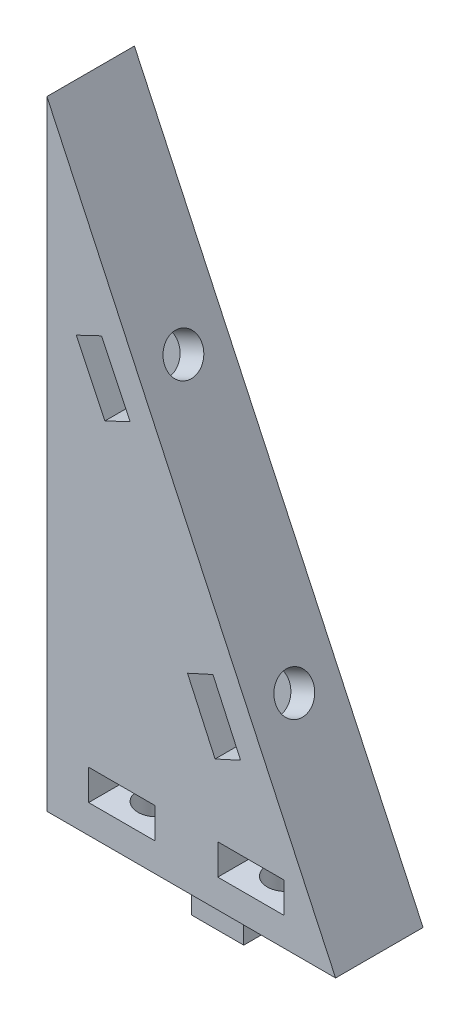
ISO-10303-21;
HEADER;
FILE_DESCRIPTION(('STEP AP214'),'2;1');
FILE_NAME('part.step','',(''),(''),'','','');
FILE_SCHEMA(('AUTOMOTIVE_DESIGN { 1 0 10303 214 1 1 1 1 }'));
ENDSEC;
DATA;
#1=APPLICATION_CONTEXT('core data for automotive mechanical design processes');
#2=APPLICATION_PROTOCOL_DEFINITION('international standard','automotive_design',2000,#1);
#3=PRODUCT_CONTEXT('',#1,'mechanical');
#4=PRODUCT('Part','Part','',(#3));
#5=PRODUCT_RELATED_PRODUCT_CATEGORY('part','',(#4));
#6=PRODUCT_DEFINITION_FORMATION('','',#4);
#7=PRODUCT_DEFINITION_CONTEXT('part definition',#1,'design');
#8=PRODUCT_DEFINITION('design','',#6,#7);
#9=PRODUCT_DEFINITION_SHAPE('','',#8);
#10=(LENGTH_UNIT() NAMED_UNIT(*) SI_UNIT(.MILLI.,.METRE.));
#11=(NAMED_UNIT(*) PLANE_ANGLE_UNIT() SI_UNIT($,.RADIAN.));
#12=(NAMED_UNIT(*) SI_UNIT($,.STERADIAN.) SOLID_ANGLE_UNIT());
#13=UNCERTAINTY_MEASURE_WITH_UNIT(LENGTH_MEASURE(1.E-05),#10,'distance_accuracy_value','');
#14=(GEOMETRIC_REPRESENTATION_CONTEXT(3) GLOBAL_UNCERTAINTY_ASSIGNED_CONTEXT((#13)) GLOBAL_UNIT_ASSIGNED_CONTEXT((#10,
#11,#12)) REPRESENTATION_CONTEXT('',''));
#15=CARTESIAN_POINT('',(0.,0.,0.));
#16=DIRECTION('',(0.,0.,1.));
#17=DIRECTION('',(1.,0.,0.));
#18=AXIS2_PLACEMENT_3D('',#15,#16,#17);
#19=CARTESIAN_POINT('',(16.6637331345963,17.7599657911358,5.));
#20=DIRECTION('',(0.906307787036648,0.422618261740704,0.));
#21=DIRECTION('',(-0.422618261740704,0.906307787036648,0.));
#22=AXIS2_PLACEMENT_3D('',#19,#20,#21);
#23=CYLINDRICAL_SURFACE('',#22,2.15);
#24=CARTESIAN_POINT('',(20.5601904393254,19.5769136720049,5.));
#25=DIRECTION('',(0.909777493819102,0.415096268039396,0.));
#26=DIRECTION('',(-0.415096268039396,0.909777493819102,0.));
#27=AXIS2_PLACEMENT_3D('',#24,#25,#26);
#28=ELLIPSE('',#27,2.15007376822944,2.15);
#29=CARTESIAN_POINT('',(19.6677028421239,21.5330023963909,5.));
#30=VERTEX_POINT('',#29);
#31=EDGE_CURVE('E500',#30,#30,#28,.F.);
#32=ORIENTED_EDGE('',*,*,#31,.T.);
#33=EDGE_LOOP('',(#32));
#34=FACE_BOUND('',#33,.T.);
#35=CARTESIAN_POINT('',(23.2797799799638,20.8450791018429,5.));
#36=DIRECTION('',(0.906307787036648,0.422618261740704,0.));
#37=DIRECTION('',(-0.422618261740704,0.906307787036648,0.));
#38=AXIS2_PLACEMENT_3D('',#35,#36,#37);
#39=CIRCLE('',#38,2.15);
#40=CARTESIAN_POINT('',(22.3711507172213,22.7936408439717,5.));
#41=VERTEX_POINT('',#40);
#42=EDGE_CURVE('E385',#41,#41,#39,.T.);
#43=ORIENTED_EDGE('',*,*,#42,.T.);
#44=EDGE_LOOP('',(#43));
#45=FACE_BOUND('',#44,.T.);
#46=ADVANCED_FACE('F38',(#34,#45),#23,.F.);
#47=CARTESIAN_POINT('',(0.,0.,10.));
#48=DIRECTION('',(0.,0.,-1.));
#49=DIRECTION('',(-1.,0.,0.));
#50=AXIS2_PLACEMENT_3D('',#47,#48,#49);
#51=PLANE('',#50);
#52=DIRECTION('',(-0.430111255691984,0.902775890089597,0.));
#53=VECTOR('',#52,1.);
#54=CARTESIAN_POINT('',(7.88044131743355,46.7688135237958,10.));
#55=LINE('',#54,#53);
#56=CARTESIAN_POINT('',(9.51486408906308,43.3382651414554,10.));
#57=VERTEX_POINT('',#56);
#58=CARTESIAN_POINT('',(6.24601854580401,50.1993619061363,10.));
#59=VERTEX_POINT('',#58);
#60=EDGE_CURVE('E213',#57,#59,#55,.T.);
#61=ORIENTED_EDGE('',*,*,#60,.F.);
#62=DIRECTION('',(0.902775890089597,0.430111255691984,0.));
#63=VECTOR('',#62,1.);
#64=CARTESIAN_POINT('',(6.62598124077637,41.961909123241,10.));
#65=LINE('',#64,#63);
#66=CARTESIAN_POINT('',(6.62598124077637,41.961909123241,10.));
#67=VERTEX_POINT('',#66);
#68=EDGE_CURVE('E56',#67,#57,#65,.T.);
#69=ORIENTED_EDGE('',*,*,#68,.F.);
#70=DIRECTION('',(0.430111255691984,-0.902775890089597,0.));
#71=VECTOR('',#70,1.);
#72=CARTESIAN_POINT('',(3.3571356975173,48.8230058879219,10.));
#73=LINE('',#72,#71);
#74=CARTESIAN_POINT('',(3.3571356975173,48.8230058879219,10.));
#75=VERTEX_POINT('',#74);
#76=EDGE_CURVE('E236',#75,#67,#73,.T.);
#77=ORIENTED_EDGE('',*,*,#76,.F.);
#78=DIRECTION('',(-0.902775890089597,-0.430111255691984,0.));
#79=VECTOR('',#78,1.);
#80=CARTESIAN_POINT('',(6.24601854580401,50.1993619061363,10.));
#81=LINE('',#80,#79);
#82=EDGE_CURVE('E232',#59,#75,#81,.T.);
#83=ORIENTED_EDGE('',*,*,#82,.F.);
#84=EDGE_LOOP('',(#61,#69,#77,#83));
#85=FACE_BOUND('',#84,.T.);
#86=DIRECTION('',(0.415096268039402,-0.909777493819099,0.));
#87=VECTOR('',#86,1.);
#88=CARTESIAN_POINT('',(19.2243599685231,14.7956336294728,10.));
#89=LINE('',#88,#87);
#90=CARTESIAN_POINT('',(16.0696283314237,21.709942582498,10.));
#91=VERTEX_POINT('',#90);
#92=CARTESIAN_POINT('',(19.2243599685231,14.7956336294728,10.));
#93=VERTEX_POINT('',#92);
#94=EDGE_CURVE('E270',#91,#93,#89,.T.);
#95=ORIENTED_EDGE('',*,*,#94,.F.);
#96=DIRECTION('',(-0.909777493819099,-0.415096268039402,0.));
#97=VECTOR('',#96,1.);
#98=CARTESIAN_POINT('',(16.0696283314237,21.709942582498,10.));
#99=LINE('',#98,#97);
#100=CARTESIAN_POINT('',(18.9809163116448,23.0382506402241,10.));
#101=VERTEX_POINT('',#100);
#102=EDGE_CURVE('E64',#101,#91,#99,.T.);
#103=ORIENTED_EDGE('',*,*,#102,.F.);
#104=DIRECTION('',(-0.415096268039396,0.909777493819102,0.));
#105=VECTOR('',#104,1.);
#106=CARTESIAN_POINT('',(18.9809163116448,23.0382506402241,10.));
#107=LINE('',#106,#105);
#108=CARTESIAN_POINT('',(22.1356479487443,16.1239416871989,10.));
#109=VERTEX_POINT('',#108);
#110=EDGE_CURVE('E256',#109,#101,#107,.T.);
#111=ORIENTED_EDGE('',*,*,#110,.F.);
#112=DIRECTION('',(0.9097774938191,0.415096268039401,0.));
#113=VECTOR('',#112,1.);
#114=CARTESIAN_POINT('',(22.1356479487443,16.1239416871989,10.));
#115=LINE('',#114,#113);
#116=EDGE_CURVE('E274',#93,#109,#115,.T.);
#117=ORIENTED_EDGE('',*,*,#116,.F.);
#118=EDGE_LOOP('',(#95,#103,#111,#117));
#119=FACE_BOUND('',#118,.T.);
#120=DIRECTION('',(1.,0.,0.));
#121=VECTOR('',#120,1.);
#122=CARTESIAN_POINT('',(0.,6.75172864189275,10.));
#123=LINE('',#122,#121);
#124=CARTESIAN_POINT('',(19.53,6.75172864189274,10.));
#125=VERTEX_POINT('',#124);
#126=CARTESIAN_POINT('',(27.13,6.75172864189274,10.));
#127=VERTEX_POINT('',#126);
#128=EDGE_CURVE('E350',#125,#127,#123,.T.);
#129=ORIENTED_EDGE('',*,*,#128,.T.);
#130=DIRECTION('',(0.,-1.,0.));
#131=VECTOR('',#130,1.);
#132=CARTESIAN_POINT('',(27.13,0.,10.));
#133=LINE('',#132,#131);
#134=CARTESIAN_POINT('',(27.13,3.25172864189274,10.));
#135=VERTEX_POINT('',#134);
#136=EDGE_CURVE('E354',#127,#135,#133,.T.);
#137=ORIENTED_EDGE('',*,*,#136,.T.);
#138=DIRECTION('',(-1.,0.,0.));
#139=VECTOR('',#138,1.);
#140=CARTESIAN_POINT('',(0.,3.25172864189274,10.));
#141=LINE('',#140,#139);
#142=CARTESIAN_POINT('',(19.53,3.25172864189274,10.));
#143=VERTEX_POINT('',#142);
#144=EDGE_CURVE('E359',#135,#143,#141,.T.);
#145=ORIENTED_EDGE('',*,*,#144,.T.);
#146=DIRECTION('',(0.,1.,0.));
#147=VECTOR('',#146,1.);
#148=CARTESIAN_POINT('',(19.53,0.,10.));
#149=LINE('',#148,#147);
#150=EDGE_CURVE('E340',#143,#125,#149,.T.);
#151=ORIENTED_EDGE('',*,*,#150,.T.);
#152=EDGE_LOOP('',(#129,#137,#145,#151));
#153=FACE_BOUND('',#152,.T.);
#154=DIRECTION('',(-0.422618261740704,0.906307787036648,0.));
#155=VECTOR('',#154,1.);
#156=CARTESIAN_POINT('',(33.,0.,10.));
#157=LINE('',#156,#155);
#158=CARTESIAN_POINT('',(33.,0.,10.));
#159=VERTEX_POINT('',#158);
#160=CARTESIAN_POINT('',(0.,70.7687283768145,10.));
#161=VERTEX_POINT('',#160);
#162=EDGE_CURVE('E459',#159,#161,#157,.T.);
#163=ORIENTED_EDGE('',*,*,#162,.T.);
#164=DIRECTION('',(0.,-1.,0.));
#165=VECTOR('',#164,1.);
#166=CARTESIAN_POINT('',(0.,70.7687283768145,10.));
#167=LINE('',#166,#165);
#168=CARTESIAN_POINT('',(0.,0.,10.));
#169=VERTEX_POINT('',#168);
#170=EDGE_CURVE('E463',#161,#169,#167,.T.);
#171=ORIENTED_EDGE('',*,*,#170,.T.);
#172=DIRECTION('',(1.,0.,0.));
#173=VECTOR('',#172,1.);
#174=CARTESIAN_POINT('',(0.,0.,10.));
#175=LINE('',#174,#173);
#176=EDGE_CURVE('E467',#169,#159,#175,.T.);
#177=ORIENTED_EDGE('',*,*,#176,.T.);
#178=EDGE_LOOP('',(#163,#171,#177));
#179=FACE_BOUND('',#178,.T.);
#180=DIRECTION('',(0.,-1.,0.));
#181=VECTOR('',#180,1.);
#182=CARTESIAN_POINT('',(12.3679115650385,0.,10.));
#183=LINE('',#182,#181);
#184=CARTESIAN_POINT('',(12.3679115650385,6.75172864189274,10.));
#185=VERTEX_POINT('',#184);
#186=CARTESIAN_POINT('',(12.3679115650385,3.25172864189274,10.));
#187=VERTEX_POINT('',#186);
#188=EDGE_CURVE('E306',#185,#187,#183,.T.);
#189=ORIENTED_EDGE('',*,*,#188,.T.);
#190=DIRECTION('',(-1.,0.,0.));
#191=VECTOR('',#190,1.);
#192=CARTESIAN_POINT('',(0.,3.25172864189274,10.));
#193=LINE('',#192,#191);
#194=CARTESIAN_POINT('',(4.76791156503854,3.25172864189274,10.));
#195=VERTEX_POINT('',#194);
#196=EDGE_CURVE('E296',#187,#195,#193,.T.);
#197=ORIENTED_EDGE('',*,*,#196,.T.);
#198=DIRECTION('',(0.,1.,0.));
#199=VECTOR('',#198,1.);
#200=CARTESIAN_POINT('',(4.76791156503854,0.,10.));
#201=LINE('',#200,#199);
#202=CARTESIAN_POINT('',(4.76791156503854,6.75172864189274,10.));
#203=VERTEX_POINT('',#202);
#204=EDGE_CURVE('E314',#195,#203,#201,.T.);
#205=ORIENTED_EDGE('',*,*,#204,.T.);
#206=DIRECTION('',(1.,0.,0.));
#207=VECTOR('',#206,1.);
#208=CARTESIAN_POINT('',(0.,6.75172864189274,10.));
#209=LINE('',#208,#207);
#210=EDGE_CURVE('E310',#203,#185,#209,.T.);
#211=ORIENTED_EDGE('',*,*,#210,.T.);
#212=EDGE_LOOP('',(#189,#197,#205,#211));
#213=FACE_BOUND('',#212,.T.);
#214=ADVANCED_FACE('F532',(#85,#119,#153,#179,#213),#51,.F.);
#215=CARTESIAN_POINT('',(8.55,12.,6.));
#216=DIRECTION('',(0.,-1.,0.));
#217=DIRECTION('',(1.,0.,0.));
#218=AXIS2_PLACEMENT_3D('',#215,#216,#217);
#219=CYLINDRICAL_SURFACE('',#218,2.15);
#220=CARTESIAN_POINT('',(8.55,0.,6.));
#221=DIRECTION('',(0.,-1.,0.));
#222=DIRECTION('',(1.,0.,0.));
#223=AXIS2_PLACEMENT_3D('',#220,#221,#222);
#224=CIRCLE('',#223,2.15);
#225=CARTESIAN_POINT('',(10.7,0.,6.));
#226=VERTEX_POINT('',#225);
#227=EDGE_CURVE('E384',#226,#226,#224,.T.);
#228=ORIENTED_EDGE('',*,*,#227,.T.);
#229=EDGE_LOOP('',(#228));
#230=FACE_BOUND('',#229,.T.);
#231=CARTESIAN_POINT('',(8.55,3.25172864189274,6.));
#232=DIRECTION('',(0.,1.,0.));
#233=DIRECTION('',(0.,0.,1.));
#234=AXIS2_PLACEMENT_3D('',#231,#232,#233);
#235=CIRCLE('',#234,2.15);
#236=CARTESIAN_POINT('',(8.55,3.25172864189274,8.15));
#237=VERTEX_POINT('',#236);
#238=EDGE_CURVE('E355',#237,#237,#235,.F.);
#239=ORIENTED_EDGE('',*,*,#238,.F.);
#240=EDGE_LOOP('',(#239));
#241=FACE_BOUND('',#240,.T.);
#242=ADVANCED_FACE('F539',(#230,#241),#219,.F.);
#243=CARTESIAN_POINT('',(23.33,12.,6.));
#244=DIRECTION('',(0.,-1.,0.));
#245=DIRECTION('',(1.,0.,0.));
#246=AXIS2_PLACEMENT_3D('',#243,#244,#245);
#247=CYLINDRICAL_SURFACE('',#246,2.15);
#248=CARTESIAN_POINT('',(23.33,0.,6.));
#249=DIRECTION('',(0.,-1.,0.));
#250=DIRECTION('',(1.,0.,0.));
#251=AXIS2_PLACEMENT_3D('',#248,#249,#250);
#252=CIRCLE('',#251,2.15);
#253=CARTESIAN_POINT('',(25.48,0.,6.));
#254=VERTEX_POINT('',#253);
#255=EDGE_CURVE('E403',#254,#254,#252,.T.);
#256=ORIENTED_EDGE('',*,*,#255,.T.);
#257=EDGE_LOOP('',(#256));
#258=FACE_BOUND('',#257,.T.);
#259=CARTESIAN_POINT('',(23.33,3.25172864189274,6.));
#260=DIRECTION('',(0.,1.,0.));
#261=DIRECTION('',(0.,0.,1.));
#262=AXIS2_PLACEMENT_3D('',#259,#260,#261);
#263=CIRCLE('',#262,2.15);
#264=CARTESIAN_POINT('',(23.33,3.25172864189274,8.15));
#265=VERTEX_POINT('',#264);
#266=EDGE_CURVE('E379',#265,#265,#263,.F.);
#267=ORIENTED_EDGE('',*,*,#266,.F.);
#268=EDGE_LOOP('',(#267));
#269=FACE_BOUND('',#268,.T.);
#270=ADVANCED_FACE('F627',(#258,#269),#247,.F.);
#271=CARTESIAN_POINT('',(0.,0.,10.));
#272=DIRECTION('',(0.,1.,0.));
#273=DIRECTION('',(0.,0.,1.));
#274=AXIS2_PLACEMENT_3D('',#271,#272,#273);
#275=PLANE('',#274);
#276=ORIENTED_EDGE('',*,*,#255,.F.);
#277=EDGE_LOOP('',(#276));
#278=FACE_BOUND('',#277,.T.);
#279=ORIENTED_EDGE('',*,*,#227,.F.);
#280=EDGE_LOOP('',(#279));
#281=FACE_BOUND('',#280,.T.);
#282=DIRECTION('',(1.,0.,0.));
#283=VECTOR('',#282,1.);
#284=CARTESIAN_POINT('',(0.,0.,0.));
#285=LINE('',#284,#283);
#286=CARTESIAN_POINT('',(0.,0.,0.));
#287=VERTEX_POINT('',#286);
#288=CARTESIAN_POINT('',(33.,0.,0.));
#289=VERTEX_POINT('',#288);
#290=EDGE_CURVE('E464',#287,#289,#285,.T.);
#291=ORIENTED_EDGE('',*,*,#290,.T.);
#292=DIRECTION('',(0.,0.,-1.));
#293=VECTOR('',#292,1.);
#294=CARTESIAN_POINT('',(33.,0.,10.));
#295=LINE('',#294,#293);
#296=EDGE_CURVE('E470',#159,#289,#295,.T.);
#297=ORIENTED_EDGE('',*,*,#296,.F.);
#298=ORIENTED_EDGE('',*,*,#176,.F.);
#299=DIRECTION('',(0.,0.,-1.));
#300=VECTOR('',#299,1.);
#301=CARTESIAN_POINT('',(0.,0.,10.));
#302=LINE('',#301,#300);
#303=EDGE_CURVE('E48',#169,#287,#302,.T.);
#304=ORIENTED_EDGE('',*,*,#303,.T.);
#305=EDGE_LOOP('',(#291,#297,#298,#304));
#306=FACE_BOUND('',#305,.T.);
#307=DIRECTION('',(0.,0.,1.));
#308=VECTOR('',#307,1.);
#309=CARTESIAN_POINT('',(19.5,0.,7.));
#310=LINE('',#309,#308);
#311=CARTESIAN_POINT('',(19.5,0.,3.));
#312=VERTEX_POINT('',#311);
#313=CARTESIAN_POINT('',(19.5,0.,7.));
#314=VERTEX_POINT('',#313);
#315=EDGE_CURVE('E402',#312,#314,#310,.T.);
#316=ORIENTED_EDGE('',*,*,#315,.F.);
#317=DIRECTION('',(1.,0.,0.));
#318=VECTOR('',#317,1.);
#319=CARTESIAN_POINT('',(13.5,0.,3.));
#320=LINE('',#319,#318);
#321=CARTESIAN_POINT('',(13.5,0.,3.));
#322=VERTEX_POINT('',#321);
#323=EDGE_CURVE('E419',#322,#312,#320,.T.);
#324=ORIENTED_EDGE('',*,*,#323,.F.);
#325=DIRECTION('',(0.,0.,-1.));
#326=VECTOR('',#325,1.);
#327=CARTESIAN_POINT('',(13.5,0.,7.));
#328=LINE('',#327,#326);
#329=CARTESIAN_POINT('',(13.5,0.,7.));
#330=VERTEX_POINT('',#329);
#331=EDGE_CURVE('E436',#330,#322,#328,.T.);
#332=ORIENTED_EDGE('',*,*,#331,.F.);
#333=DIRECTION('',(-1.,0.,0.));
#334=VECTOR('',#333,1.);
#335=CARTESIAN_POINT('',(13.5,0.,7.));
#336=LINE('',#335,#334);
#337=EDGE_CURVE('E432',#314,#330,#336,.T.);
#338=ORIENTED_EDGE('',*,*,#337,.F.);
#339=EDGE_LOOP('',(#316,#324,#332,#338));
#340=FACE_BOUND('',#339,.T.);
#341=ADVANCED_FACE('F636',(#278,#281,#306,#340),#275,.F.);
#342=CARTESIAN_POINT('',(33.,0.,10.));
#343=DIRECTION('',(-0.906307787036648,-0.422618261740704,0.));
#344=DIRECTION('',(0.422618261740704,-0.906307787036648,0.));
#345=AXIS2_PLACEMENT_3D('',#342,#343,#344);
#346=PLANE('',#345);
#347=ORIENTED_EDGE('',*,*,#42,.F.);
#348=EDGE_LOOP('',(#347));
#349=FACE_BOUND('',#348,.T.);
#350=CARTESIAN_POINT('',(10.6012321277427,48.0343127129423,5.));
#351=DIRECTION('',(0.906307787036648,0.422618261740704,0.));
#352=DIRECTION('',(-0.422618261740704,0.906307787036648,0.));
#353=AXIS2_PLACEMENT_3D('',#350,#351,#352);
#354=CIRCLE('',#353,2.15);
#355=CARTESIAN_POINT('',(9.69260286500018,49.9828744550711,5.));
#356=VERTEX_POINT('',#355);
#357=EDGE_CURVE('E393',#356,#356,#354,.T.);
#358=ORIENTED_EDGE('',*,*,#357,.F.);
#359=EDGE_LOOP('',(#358));
#360=FACE_BOUND('',#359,.T.);
#361=DIRECTION('',(-0.422618261740704,0.906307787036648,0.));
#362=VECTOR('',#361,1.);
#363=CARTESIAN_POINT('',(33.,0.,0.));
#364=LINE('',#363,#362);
#365=CARTESIAN_POINT('',(0.,70.7687283768145,0.));
#366=VERTEX_POINT('',#365);
#367=EDGE_CURVE('E458',#289,#366,#364,.T.);
#368=ORIENTED_EDGE('',*,*,#367,.T.);
#369=DIRECTION('',(0.,0.,-1.));
#370=VECTOR('',#369,1.);
#371=CARTESIAN_POINT('',(0.,70.7687283768145,10.));
#372=LINE('',#371,#370);
#373=EDGE_CURVE('E11',#161,#366,#372,.T.);
#374=ORIENTED_EDGE('',*,*,#373,.F.);
#375=ORIENTED_EDGE('',*,*,#162,.F.);
#376=ORIENTED_EDGE('',*,*,#296,.T.);
#377=EDGE_LOOP('',(#368,#374,#375,#376));
#378=FACE_BOUND('',#377,.T.);
#379=ADVANCED_FACE('F40',(#349,#360,#378),#346,.F.);
#380=CARTESIAN_POINT('',(0.,70.7687283768145,10.));
#381=DIRECTION('',(1.,0.,0.));
#382=DIRECTION('',(0.,1.,0.));
#383=AXIS2_PLACEMENT_3D('',#380,#381,#382);
#384=PLANE('',#383);
#385=DIRECTION('',(0.,-1.,0.));
#386=VECTOR('',#385,1.);
#387=CARTESIAN_POINT('',(0.,70.7687283768145,0.));
#388=LINE('',#387,#386);
#389=EDGE_CURVE('E474',#366,#287,#388,.T.);
#390=ORIENTED_EDGE('',*,*,#389,.T.);
#391=ORIENTED_EDGE('',*,*,#303,.F.);
#392=ORIENTED_EDGE('',*,*,#170,.F.);
#393=ORIENTED_EDGE('',*,*,#373,.T.);
#394=EDGE_LOOP('',(#390,#391,#392,#393));
#395=FACE_BOUND('',#394,.T.);
#396=ADVANCED_FACE('F684',(#395),#384,.F.);
#397=CARTESIAN_POINT('',(0.,0.,0.));
#398=DIRECTION('',(0.,0.,-1.));
#399=DIRECTION('',(-1.,0.,0.));
#400=AXIS2_PLACEMENT_3D('',#397,#398,#399);
#401=PLANE('',#400);
#402=ORIENTED_EDGE('',*,*,#367,.F.);
#403=ORIENTED_EDGE('',*,*,#290,.F.);
#404=ORIENTED_EDGE('',*,*,#389,.F.);
#405=EDGE_LOOP('',(#402,#403,#404));
#406=FACE_BOUND('',#405,.T.);
#407=ADVANCED_FACE('F679',(#406),#401,.T.);
#408=CARTESIAN_POINT('',(19.5,-5.,7.));
#409=DIRECTION('',(-1.,0.,0.));
#410=DIRECTION('',(0.,-1.,0.));
#411=AXIS2_PLACEMENT_3D('',#408,#409,#410);
#412=PLANE('',#411);
#413=ORIENTED_EDGE('',*,*,#315,.T.);
#414=DIRECTION('',(0.,1.,0.));
#415=VECTOR('',#414,1.);
#416=CARTESIAN_POINT('',(19.5,-5.,7.));
#417=LINE('',#416,#415);
#418=CARTESIAN_POINT('',(19.5,-5.,7.));
#419=VERTEX_POINT('',#418);
#420=EDGE_CURVE('E454',#419,#314,#417,.T.);
#421=ORIENTED_EDGE('',*,*,#420,.F.);
#422=DIRECTION('',(0.,0.,1.));
#423=VECTOR('',#422,1.);
#424=CARTESIAN_POINT('',(19.5,-5.,7.));
#425=LINE('',#424,#423);
#426=CARTESIAN_POINT('',(19.5,-5.,3.));
#427=VERTEX_POINT('',#426);
#428=EDGE_CURVE('E414',#427,#419,#425,.T.);
#429=ORIENTED_EDGE('',*,*,#428,.F.);
#430=DIRECTION('',(0.,1.,0.));
#431=VECTOR('',#430,1.);
#432=CARTESIAN_POINT('',(19.5,-5.,3.));
#433=LINE('',#432,#431);
#434=EDGE_CURVE('E428',#427,#312,#433,.T.);
#435=ORIENTED_EDGE('',*,*,#434,.T.);
#436=EDGE_LOOP('',(#413,#421,#429,#435));
#437=FACE_BOUND('',#436,.T.);
#438=ADVANCED_FACE('F664',(#437),#412,.F.);
#439=CARTESIAN_POINT('',(13.5,-5.,7.));
#440=DIRECTION('',(0.,0.,-1.));
#441=DIRECTION('',(-1.,0.,0.));
#442=AXIS2_PLACEMENT_3D('',#439,#440,#441);
#443=PLANE('',#442);
#444=ORIENTED_EDGE('',*,*,#337,.T.);
#445=DIRECTION('',(0.,1.,0.));
#446=VECTOR('',#445,1.);
#447=CARTESIAN_POINT('',(13.5,-5.,7.));
#448=LINE('',#447,#446);
#449=CARTESIAN_POINT('',(13.5,-5.,7.));
#450=VERTEX_POINT('',#449);
#451=EDGE_CURVE('E450',#450,#330,#448,.T.);
#452=ORIENTED_EDGE('',*,*,#451,.F.);
#453=DIRECTION('',(-1.,0.,0.));
#454=VECTOR('',#453,1.);
#455=CARTESIAN_POINT('',(13.5,-5.,7.));
#456=LINE('',#455,#454);
#457=EDGE_CURVE('E418',#419,#450,#456,.T.);
#458=ORIENTED_EDGE('',*,*,#457,.F.);
#459=ORIENTED_EDGE('',*,*,#420,.T.);
#460=EDGE_LOOP('',(#444,#452,#458,#459));
#461=FACE_BOUND('',#460,.T.);
#462=ADVANCED_FACE('F671',(#461),#443,.F.);
#463=CARTESIAN_POINT('',(13.5,-5.,7.));
#464=DIRECTION('',(1.,0.,0.));
#465=DIRECTION('',(0.,1.,0.));
#466=AXIS2_PLACEMENT_3D('',#463,#464,#465);
#467=PLANE('',#466);
#468=ORIENTED_EDGE('',*,*,#331,.T.);
#469=DIRECTION('',(0.,1.,0.));
#470=VECTOR('',#469,1.);
#471=CARTESIAN_POINT('',(13.5,-5.,3.));
#472=LINE('',#471,#470);
#473=CARTESIAN_POINT('',(13.5,-5.,3.));
#474=VERTEX_POINT('',#473);
#475=EDGE_CURVE('E446',#474,#322,#472,.T.);
#476=ORIENTED_EDGE('',*,*,#475,.F.);
#477=DIRECTION('',(0.,0.,-1.));
#478=VECTOR('',#477,1.);
#479=CARTESIAN_POINT('',(13.5,-5.,7.));
#480=LINE('',#479,#478);
#481=EDGE_CURVE('E422',#450,#474,#480,.T.);
#482=ORIENTED_EDGE('',*,*,#481,.F.);
#483=ORIENTED_EDGE('',*,*,#451,.T.);
#484=EDGE_LOOP('',(#468,#476,#482,#483));
#485=FACE_BOUND('',#484,.T.);
#486=ADVANCED_FACE('F669',(#485),#467,.F.);
#487=CARTESIAN_POINT('',(13.5,-5.,3.));
#488=DIRECTION('',(0.,0.,1.));
#489=DIRECTION('',(1.,0.,0.));
#490=AXIS2_PLACEMENT_3D('',#487,#488,#489);
#491=PLANE('',#490);
#492=ORIENTED_EDGE('',*,*,#323,.T.);
#493=ORIENTED_EDGE('',*,*,#434,.F.);
#494=DIRECTION('',(1.,0.,0.));
#495=VECTOR('',#494,1.);
#496=CARTESIAN_POINT('',(13.5,-5.,3.));
#497=LINE('',#496,#495);
#498=EDGE_CURVE('E425',#474,#427,#497,.T.);
#499=ORIENTED_EDGE('',*,*,#498,.F.);
#500=ORIENTED_EDGE('',*,*,#475,.T.);
#501=EDGE_LOOP('',(#492,#493,#499,#500));
#502=FACE_BOUND('',#501,.T.);
#503=ADVANCED_FACE('F660',(#502),#491,.F.);
#504=CARTESIAN_POINT('',(0.,-5.,0.));
#505=DIRECTION('',(0.,-1.,0.));
#506=DIRECTION('',(1.,0.,0.));
#507=AXIS2_PLACEMENT_3D('',#504,#505,#506);
#508=PLANE('',#507);
#509=ORIENTED_EDGE('',*,*,#428,.T.);
#510=ORIENTED_EDGE('',*,*,#457,.T.);
#511=ORIENTED_EDGE('',*,*,#481,.T.);
#512=ORIENTED_EDGE('',*,*,#498,.T.);
#513=EDGE_LOOP('',(#509,#510,#511,#512));
#514=FACE_BOUND('',#513,.T.);
#515=ADVANCED_FACE('F618',(#514),#508,.T.);
#516=CARTESIAN_POINT('',(3.98518528237516,44.9491994022352,5.));
#517=DIRECTION('',(0.906307787036648,0.422618261740704,0.));
#518=DIRECTION('',(-0.422618261740704,0.906307787036648,0.));
#519=AXIS2_PLACEMENT_3D('',#516,#517,#518);
#520=CYLINDRICAL_SURFACE('',#519,2.15);
#521=CARTESIAN_POINT('',(7.88169905458666,46.7661736143239,5.));
#522=DIRECTION('',(0.902775890089597,0.430111255691984,0.));
#523=DIRECTION('',(0.430111255691984,-0.902775890089597,0.));
#524=AXIS2_PLACEMENT_3D('',#521,#522,#523);
#525=ELLIPSE('',#524,2.15007376822944,2.15);
#526=CARTESIAN_POINT('',(8.80646998287022,44.8251388544522,5.));
#527=VERTEX_POINT('',#526);
#528=EDGE_CURVE('E503',#527,#527,#525,.F.);
#529=ORIENTED_EDGE('',*,*,#528,.T.);
#530=EDGE_LOOP('',(#529));
#531=FACE_BOUND('',#530,.T.);
#532=ORIENTED_EDGE('',*,*,#357,.T.);
#533=EDGE_LOOP('',(#532));
#534=FACE_BOUND('',#533,.T.);
#535=ADVANCED_FACE('F613',(#531,#534),#520,.F.);
#536=CARTESIAN_POINT('',(0.,6.75172864189275,3.5));
#537=DIRECTION('',(0.,-1.,0.));
#538=DIRECTION('',(1.,0.,0.));
#539=AXIS2_PLACEMENT_3D('',#536,#537,#538);
#540=PLANE('',#539);
#541=ORIENTED_EDGE('',*,*,#128,.F.);
#542=DIRECTION('',(0.,0.,1.));
#543=VECTOR('',#542,1.);
#544=CARTESIAN_POINT('',(19.53,6.75172864189274,3.5));
#545=LINE('',#544,#543);
#546=CARTESIAN_POINT('',(19.53,6.75172864189274,3.5));
#547=VERTEX_POINT('',#546);
#548=EDGE_CURVE('E349',#547,#125,#545,.T.);
#549=ORIENTED_EDGE('',*,*,#548,.F.);
#550=DIRECTION('',(1.,0.,0.));
#551=VECTOR('',#550,1.);
#552=CARTESIAN_POINT('',(0.,6.75172864189275,3.5));
#553=LINE('',#552,#551);
#554=CARTESIAN_POINT('',(27.13,6.75172864189274,3.5));
#555=VERTEX_POINT('',#554);
#556=EDGE_CURVE('E335',#547,#555,#553,.T.);
#557=ORIENTED_EDGE('',*,*,#556,.T.);
#558=DIRECTION('',(0.,0.,1.));
#559=VECTOR('',#558,1.);
#560=CARTESIAN_POINT('',(27.13,6.75172864189274,3.5));
#561=LINE('',#560,#559);
#562=EDGE_CURVE('E375',#555,#127,#561,.T.);
#563=ORIENTED_EDGE('',*,*,#562,.T.);
#564=EDGE_LOOP('',(#541,#549,#557,#563));
#565=FACE_BOUND('',#564,.T.);
#566=CARTESIAN_POINT('',(23.33,6.75172864189274,6.));
#567=DIRECTION('',(0.,-1.,0.));
#568=DIRECTION('',(1.,0.,0.));
#569=AXIS2_PLACEMENT_3D('',#566,#567,#568);
#570=CIRCLE('',#569,2.15);
#571=CARTESIAN_POINT('',(25.48,6.75172864189274,6.));
#572=VERTEX_POINT('',#571);
#573=EDGE_CURVE('E397',#572,#572,#570,.F.);
#574=ORIENTED_EDGE('',*,*,#573,.T.);
#575=EDGE_LOOP('',(#574));
#576=FACE_BOUND('',#575,.T.);
#577=ADVANCED_FACE('F607',(#565,#576),#540,.T.);
#578=CARTESIAN_POINT('',(0.,3.25172864189274,3.5));
#579=DIRECTION('',(0.,1.,0.));
#580=DIRECTION('',(0.,0.,1.));
#581=AXIS2_PLACEMENT_3D('',#578,#579,#580);
#582=PLANE('',#581);
#583=ORIENTED_EDGE('',*,*,#144,.F.);
#584=DIRECTION('',(0.,0.,1.));
#585=VECTOR('',#584,1.);
#586=CARTESIAN_POINT('',(27.13,3.25172864189274,3.5));
#587=LINE('',#586,#585);
#588=CARTESIAN_POINT('',(27.13,3.25172864189274,3.5));
#589=VERTEX_POINT('',#588);
#590=EDGE_CURVE('E372',#589,#135,#587,.T.);
#591=ORIENTED_EDGE('',*,*,#590,.F.);
#592=DIRECTION('',(-1.,0.,0.));
#593=VECTOR('',#592,1.);
#594=CARTESIAN_POINT('',(0.,3.25172864189274,3.5));
#595=LINE('',#594,#593);
#596=CARTESIAN_POINT('',(19.53,3.25172864189274,3.5));
#597=VERTEX_POINT('',#596);
#598=EDGE_CURVE('E343',#589,#597,#595,.T.);
#599=ORIENTED_EDGE('',*,*,#598,.T.);
#600=DIRECTION('',(0.,0.,1.));
#601=VECTOR('',#600,1.);
#602=CARTESIAN_POINT('',(19.53,3.25172864189274,3.5));
#603=LINE('',#602,#601);
#604=EDGE_CURVE('E369',#597,#143,#603,.T.);
#605=ORIENTED_EDGE('',*,*,#604,.T.);
#606=EDGE_LOOP('',(#583,#591,#599,#605));
#607=FACE_BOUND('',#606,.T.);
#608=ORIENTED_EDGE('',*,*,#266,.T.);
#609=EDGE_LOOP('',(#608));
#610=FACE_BOUND('',#609,.T.);
#611=ADVANCED_FACE('F604',(#607,#610),#582,.T.);
#612=CARTESIAN_POINT('',(27.13,0.,3.5));
#613=DIRECTION('',(-1.,0.,0.));
#614=DIRECTION('',(0.,0.,1.));
#615=AXIS2_PLACEMENT_3D('',#612,#613,#614);
#616=PLANE('',#615);
#617=ORIENTED_EDGE('',*,*,#136,.F.);
#618=ORIENTED_EDGE('',*,*,#562,.F.);
#619=DIRECTION('',(0.,-1.,0.));
#620=VECTOR('',#619,1.);
#621=CARTESIAN_POINT('',(27.13,0.,3.5));
#622=LINE('',#621,#620);
#623=EDGE_CURVE('E339',#555,#589,#622,.T.);
#624=ORIENTED_EDGE('',*,*,#623,.T.);
#625=ORIENTED_EDGE('',*,*,#590,.T.);
#626=EDGE_LOOP('',(#617,#618,#624,#625));
#627=FACE_BOUND('',#626,.T.);
#628=ADVANCED_FACE('F602',(#627),#616,.T.);
#629=CARTESIAN_POINT('',(19.53,0.,3.5));
#630=DIRECTION('',(1.,0.,0.));
#631=DIRECTION('',(0.,0.,-1.));
#632=AXIS2_PLACEMENT_3D('',#629,#630,#631);
#633=PLANE('',#632);
#634=ORIENTED_EDGE('',*,*,#150,.F.);
#635=ORIENTED_EDGE('',*,*,#604,.F.);
#636=DIRECTION('',(0.,1.,0.));
#637=VECTOR('',#636,1.);
#638=CARTESIAN_POINT('',(19.53,0.,3.5));
#639=LINE('',#638,#637);
#640=EDGE_CURVE('E346',#597,#547,#639,.T.);
#641=ORIENTED_EDGE('',*,*,#640,.T.);
#642=ORIENTED_EDGE('',*,*,#548,.T.);
#643=EDGE_LOOP('',(#634,#635,#641,#642));
#644=FACE_BOUND('',#643,.T.);
#645=ADVANCED_FACE('F598',(#644),#633,.T.);
#646=CARTESIAN_POINT('',(0.,0.,3.5));
#647=DIRECTION('',(0.,0.,-1.));
#648=DIRECTION('',(-1.,0.,0.));
#649=AXIS2_PLACEMENT_3D('',#646,#647,#648);
#650=PLANE('',#649);
#651=ORIENTED_EDGE('',*,*,#556,.F.);
#652=ORIENTED_EDGE('',*,*,#640,.F.);
#653=ORIENTED_EDGE('',*,*,#598,.F.);
#654=ORIENTED_EDGE('',*,*,#623,.F.);
#655=EDGE_LOOP('',(#651,#652,#653,#654));
#656=FACE_BOUND('',#655,.T.);
#657=ADVANCED_FACE('F594',(#656),#650,.F.);
#658=CARTESIAN_POINT('',(23.33,12.,6.));
#659=DIRECTION('',(0.,-1.,0.));
#660=DIRECTION('',(1.,0.,0.));
#661=AXIS2_PLACEMENT_3D('',#658,#659,#660);
#662=PLANE('',#661);
#663=CARTESIAN_POINT('',(23.33,12.,6.));
#664=DIRECTION('',(0.,-1.,0.));
#665=DIRECTION('',(1.,0.,0.));
#666=AXIS2_PLACEMENT_3D('',#663,#664,#665);
#667=CIRCLE('',#666,2.15);
#668=CARTESIAN_POINT('',(25.48,12.,6.));
#669=VERTEX_POINT('',#668);
#670=EDGE_CURVE('E398',#669,#669,#667,.T.);
#671=ORIENTED_EDGE('',*,*,#670,.T.);
#672=EDGE_LOOP('',(#671));
#673=FACE_BOUND('',#672,.T.);
#674=ADVANCED_FACE('F597',(#673),#662,.T.);
#675=ORIENTED_EDGE('',*,*,#670,.F.);
#676=EDGE_LOOP('',(#675));
#677=FACE_BOUND('',#676,.T.);
#678=ORIENTED_EDGE('',*,*,#573,.F.);
#679=EDGE_LOOP('',(#678));
#680=FACE_BOUND('',#679,.T.);
#681=ADVANCED_FACE('F582',(#677,#680),#247,.F.);
#682=CARTESIAN_POINT('',(0.,3.25172864189274,3.5));
#683=DIRECTION('',(0.,1.,0.));
#684=DIRECTION('',(0.,0.,1.));
#685=AXIS2_PLACEMENT_3D('',#682,#683,#684);
#686=PLANE('',#685);
#687=ORIENTED_EDGE('',*,*,#196,.F.);
#688=DIRECTION('',(0.,0.,1.));
#689=VECTOR('',#688,1.);
#690=CARTESIAN_POINT('',(12.3679115650385,3.25172864189274,3.5));
#691=LINE('',#690,#689);
#692=CARTESIAN_POINT('',(12.3679115650385,3.25172864189274,3.5));
#693=VERTEX_POINT('',#692);
#694=EDGE_CURVE('E321',#693,#187,#691,.T.);
#695=ORIENTED_EDGE('',*,*,#694,.F.);
#696=DIRECTION('',(-1.,0.,0.));
#697=VECTOR('',#696,1.);
#698=CARTESIAN_POINT('',(0.,3.25172864189274,3.5));
#699=LINE('',#698,#697);
#700=CARTESIAN_POINT('',(4.76791156503854,3.25172864189274,3.5));
#701=VERTEX_POINT('',#700);
#702=EDGE_CURVE('E302',#693,#701,#699,.T.);
#703=ORIENTED_EDGE('',*,*,#702,.T.);
#704=DIRECTION('',(0.,0.,1.));
#705=VECTOR('',#704,1.);
#706=CARTESIAN_POINT('',(4.76791156503854,3.25172864189274,3.5));
#707=LINE('',#706,#705);
#708=EDGE_CURVE('E326',#701,#195,#707,.T.);
#709=ORIENTED_EDGE('',*,*,#708,.T.);
#710=EDGE_LOOP('',(#687,#695,#703,#709));
#711=FACE_BOUND('',#710,.T.);
#712=ORIENTED_EDGE('',*,*,#238,.T.);
#713=EDGE_LOOP('',(#712));
#714=FACE_BOUND('',#713,.T.);
#715=ADVANCED_FACE('F578',(#711,#714),#686,.T.);
#716=CARTESIAN_POINT('',(0.,6.75172864189274,3.5));
#717=DIRECTION('',(0.,-1.,0.));
#718=DIRECTION('',(1.,0.,0.));
#719=AXIS2_PLACEMENT_3D('',#716,#717,#718);
#720=PLANE('',#719);
#721=ORIENTED_EDGE('',*,*,#210,.F.);
#722=DIRECTION('',(0.,0.,1.));
#723=VECTOR('',#722,1.);
#724=CARTESIAN_POINT('',(4.76791156503854,6.75172864189274,3.5));
#725=LINE('',#724,#723);
#726=CARTESIAN_POINT('',(4.76791156503854,6.75172864189274,3.5));
#727=VERTEX_POINT('',#726);
#728=EDGE_CURVE('E329',#727,#203,#725,.T.);
#729=ORIENTED_EDGE('',*,*,#728,.F.);
#730=DIRECTION('',(1.,0.,0.));
#731=VECTOR('',#730,1.);
#732=CARTESIAN_POINT('',(0.,6.75172864189274,3.5));
#733=LINE('',#732,#731);
#734=CARTESIAN_POINT('',(12.3679115650385,6.75172864189274,3.5));
#735=VERTEX_POINT('',#734);
#736=EDGE_CURVE('E295',#727,#735,#733,.T.);
#737=ORIENTED_EDGE('',*,*,#736,.T.);
#738=DIRECTION('',(0.,0.,1.));
#739=VECTOR('',#738,1.);
#740=CARTESIAN_POINT('',(12.3679115650385,6.75172864189274,3.5));
#741=LINE('',#740,#739);
#742=EDGE_CURVE('E305',#735,#185,#741,.T.);
#743=ORIENTED_EDGE('',*,*,#742,.T.);
#744=EDGE_LOOP('',(#721,#729,#737,#743));
#745=FACE_BOUND('',#744,.T.);
#746=CARTESIAN_POINT('',(8.55,6.75172864189274,6.));
#747=DIRECTION('',(0.,-1.,0.));
#748=DIRECTION('',(1.,0.,0.));
#749=AXIS2_PLACEMENT_3D('',#746,#747,#748);
#750=CIRCLE('',#749,2.15);
#751=CARTESIAN_POINT('',(10.7,6.75172864189274,6.));
#752=VERTEX_POINT('',#751);
#753=EDGE_CURVE('E325',#752,#752,#750,.F.);
#754=ORIENTED_EDGE('',*,*,#753,.T.);
#755=EDGE_LOOP('',(#754));
#756=FACE_BOUND('',#755,.T.);
#757=ADVANCED_FACE('F581',(#745,#756),#720,.T.);
#758=CARTESIAN_POINT('',(12.3679115650385,0.,3.5));
#759=DIRECTION('',(-1.,0.,0.));
#760=DIRECTION('',(0.,0.,1.));
#761=AXIS2_PLACEMENT_3D('',#758,#759,#760);
#762=PLANE('',#761);
#763=ORIENTED_EDGE('',*,*,#188,.F.);
#764=ORIENTED_EDGE('',*,*,#742,.F.);
#765=DIRECTION('',(0.,-1.,0.));
#766=VECTOR('',#765,1.);
#767=CARTESIAN_POINT('',(12.3679115650385,0.,3.5));
#768=LINE('',#767,#766);
#769=EDGE_CURVE('E291',#735,#693,#768,.T.);
#770=ORIENTED_EDGE('',*,*,#769,.T.);
#771=ORIENTED_EDGE('',*,*,#694,.T.);
#772=EDGE_LOOP('',(#763,#764,#770,#771));
#773=FACE_BOUND('',#772,.T.);
#774=ADVANCED_FACE('F586',(#773),#762,.T.);
#775=CARTESIAN_POINT('',(4.76791156503854,0.,3.5));
#776=DIRECTION('',(1.,0.,0.));
#777=DIRECTION('',(0.,0.,-1.));
#778=AXIS2_PLACEMENT_3D('',#775,#776,#777);
#779=PLANE('',#778);
#780=ORIENTED_EDGE('',*,*,#204,.F.);
#781=ORIENTED_EDGE('',*,*,#708,.F.);
#782=DIRECTION('',(0.,1.,0.));
#783=VECTOR('',#782,1.);
#784=CARTESIAN_POINT('',(4.76791156503854,0.,3.5));
#785=LINE('',#784,#783);
#786=EDGE_CURVE('E299',#701,#727,#785,.T.);
#787=ORIENTED_EDGE('',*,*,#786,.T.);
#788=ORIENTED_EDGE('',*,*,#728,.T.);
#789=EDGE_LOOP('',(#780,#781,#787,#788));
#790=FACE_BOUND('',#789,.T.);
#791=ADVANCED_FACE('F576',(#790),#779,.T.);
#792=CARTESIAN_POINT('',(0.,0.,3.5));
#793=DIRECTION('',(0.,0.,1.));
#794=DIRECTION('',(1.,0.,0.));
#795=AXIS2_PLACEMENT_3D('',#792,#793,#794);
#796=PLANE('',#795);
#797=ORIENTED_EDGE('',*,*,#769,.F.);
#798=ORIENTED_EDGE('',*,*,#736,.F.);
#799=ORIENTED_EDGE('',*,*,#786,.F.);
#800=ORIENTED_EDGE('',*,*,#702,.F.);
#801=EDGE_LOOP('',(#797,#798,#799,#800));
#802=FACE_BOUND('',#801,.T.);
#803=ADVANCED_FACE('F572',(#802),#796,.T.);
#804=CARTESIAN_POINT('',(8.55,12.,6.));
#805=DIRECTION('',(0.,-1.,0.));
#806=DIRECTION('',(1.,0.,0.));
#807=AXIS2_PLACEMENT_3D('',#804,#805,#806);
#808=PLANE('',#807);
#809=CARTESIAN_POINT('',(8.55,12.,6.));
#810=DIRECTION('',(0.,-1.,0.));
#811=DIRECTION('',(1.,0.,0.));
#812=AXIS2_PLACEMENT_3D('',#809,#810,#811);
#813=CIRCLE('',#812,2.15);
#814=CARTESIAN_POINT('',(10.7,12.,6.));
#815=VERTEX_POINT('',#814);
#816=EDGE_CURVE('E407',#815,#815,#813,.T.);
#817=ORIENTED_EDGE('',*,*,#816,.T.);
#818=EDGE_LOOP('',(#817));
#819=FACE_BOUND('',#818,.T.);
#820=ADVANCED_FACE('F575',(#819),#808,.T.);
#821=ORIENTED_EDGE('',*,*,#816,.F.);
#822=EDGE_LOOP('',(#821));
#823=FACE_BOUND('',#822,.T.);
#824=ORIENTED_EDGE('',*,*,#753,.F.);
#825=EDGE_LOOP('',(#824));
#826=FACE_BOUND('',#825,.T.);
#827=ADVANCED_FACE('F567',(#823,#826),#219,.F.);
#828=CARTESIAN_POINT('',(18.9809163116448,23.0382506402241,2.5));
#829=DIRECTION('',(0.909777493819102,0.415096268039396,0.));
#830=DIRECTION('',(-0.415096268039396,0.909777493819102,0.));
#831=AXIS2_PLACEMENT_3D('',#828,#829,#830);
#832=PLANE('',#831);
#833=ORIENTED_EDGE('',*,*,#110,.T.);
#834=DIRECTION('',(0.,0.,1.));
#835=VECTOR('',#834,1.);
#836=CARTESIAN_POINT('',(18.9809163116448,23.0382506402241,2.5));
#837=LINE('',#836,#835);
#838=CARTESIAN_POINT('',(18.9809163116448,23.0382506402241,2.5));
#839=VERTEX_POINT('',#838);
#840=EDGE_CURVE('E233',#839,#101,#837,.T.);
#841=ORIENTED_EDGE('',*,*,#840,.F.);
#842=DIRECTION('',(-0.415096268039407,0.909777493819097,0.));
#843=VECTOR('',#842,1.);
#844=CARTESIAN_POINT('',(20.5582821301945,19.5810961637115,2.5));
#845=LINE('',#844,#843);
#846=CARTESIAN_POINT('',(22.1356479487443,16.1239416871989,2.5));
#847=VERTEX_POINT('',#846);
#848=EDGE_CURVE('E264',#847,#839,#845,.T.);
#849=ORIENTED_EDGE('',*,*,#848,.F.);
#850=DIRECTION('',(0.,0.,1.));
#851=VECTOR('',#850,1.);
#852=CARTESIAN_POINT('',(22.1356479487443,16.1239416871989,2.5));
#853=LINE('',#852,#851);
#854=EDGE_CURVE('E283',#847,#109,#853,.T.);
#855=ORIENTED_EDGE('',*,*,#854,.T.);
#856=EDGE_LOOP('',(#833,#841,#849,#855));
#857=FACE_BOUND('',#856,.T.);
#858=ORIENTED_EDGE('',*,*,#31,.F.);
#859=EDGE_LOOP('',(#858));
#860=FACE_BOUND('',#859,.T.);
#861=ADVANCED_FACE('F559',(#857,#860),#832,.F.);
#862=CARTESIAN_POINT('',(19.2243599685231,14.7956336294728,2.5));
#863=DIRECTION('',(-0.909777493819099,-0.415096268039402,0.));
#864=DIRECTION('',(0.415096268039402,-0.909777493819099,0.));
#865=AXIS2_PLACEMENT_3D('',#862,#863,#864);
#866=PLANE('',#865);
#867=ORIENTED_EDGE('',*,*,#94,.T.);
#868=DIRECTION('',(0.,0.,1.));
#869=VECTOR('',#868,1.);
#870=CARTESIAN_POINT('',(19.2243599685231,14.7956336294728,2.5));
#871=LINE('',#870,#869);
#872=CARTESIAN_POINT('',(19.2243599685231,14.7956336294728,2.5));
#873=VERTEX_POINT('',#872);
#874=EDGE_CURVE('E286',#873,#93,#871,.T.);
#875=ORIENTED_EDGE('',*,*,#874,.F.);
#876=DIRECTION('',(0.415096268039402,-0.909777493819099,0.));
#877=VECTOR('',#876,1.);
#878=CARTESIAN_POINT('',(19.2243599685231,14.7956336294728,2.5));
#879=LINE('',#878,#877);
#880=CARTESIAN_POINT('',(16.0696283314237,21.709942582498,2.5));
#881=VERTEX_POINT('',#880);
#882=EDGE_CURVE('E255',#881,#873,#879,.T.);
#883=ORIENTED_EDGE('',*,*,#882,.F.);
#884=DIRECTION('',(0.,0.,1.));
#885=VECTOR('',#884,1.);
#886=CARTESIAN_POINT('',(16.0696283314237,21.709942582498,2.5));
#887=LINE('',#886,#885);
#888=EDGE_CURVE('E267',#881,#91,#887,.T.);
#889=ORIENTED_EDGE('',*,*,#888,.T.);
#890=EDGE_LOOP('',(#867,#875,#883,#889));
#891=FACE_BOUND('',#890,.T.);
#892=CARTESIAN_POINT('',(17.6599060131307,18.2244888332427,5.));
#893=DIRECTION('',(-0.909777493819099,-0.415096268039402,0.));
#894=DIRECTION('',(-0.415096268039402,0.909777493819099,0.));
#895=AXIS2_PLACEMENT_3D('',#892,#893,#894);
#896=ELLIPSE('',#895,2.15007376822944,2.15);
#897=CARTESIAN_POINT('',(16.7674184159292,20.1805775576286,5.));
#898=VERTEX_POINT('',#897);
#899=EDGE_CURVE('E245',#898,#898,#896,.F.);
#900=ORIENTED_EDGE('',*,*,#899,.F.);
#901=EDGE_LOOP('',(#900));
#902=FACE_BOUND('',#901,.T.);
#903=ADVANCED_FACE('F556',(#891,#902),#866,.F.);
#904=CARTESIAN_POINT('',(16.0696283314237,21.709942582498,2.5));
#905=DIRECTION('',(-0.415096268039402,0.909777493819099,0.));
#906=DIRECTION('',(-0.909777493819099,-0.415096268039402,0.));
#907=AXIS2_PLACEMENT_3D('',#904,#905,#906);
#908=PLANE('',#907);
#909=ORIENTED_EDGE('',*,*,#102,.T.);
#910=ORIENTED_EDGE('',*,*,#888,.F.);
#911=DIRECTION('',(-0.909777493819099,-0.415096268039402,0.));
#912=VECTOR('',#911,1.);
#913=CARTESIAN_POINT('',(16.0696283314237,21.709942582498,2.5));
#914=LINE('',#913,#912);
#915=EDGE_CURVE('E251',#839,#881,#914,.T.);
#916=ORIENTED_EDGE('',*,*,#915,.F.);
#917=ORIENTED_EDGE('',*,*,#840,.T.);
#918=EDGE_LOOP('',(#909,#910,#916,#917));
#919=FACE_BOUND('',#918,.T.);
#920=ADVANCED_FACE('F558',(#919),#908,.F.);
#921=CARTESIAN_POINT('',(22.1356479487443,16.1239416871989,2.5));
#922=DIRECTION('',(0.415096268039401,-0.9097774938191,0.));
#923=DIRECTION('',(0.9097774938191,0.415096268039401,0.));
#924=AXIS2_PLACEMENT_3D('',#921,#922,#923);
#925=PLANE('',#924);
#926=ORIENTED_EDGE('',*,*,#116,.T.);
#927=ORIENTED_EDGE('',*,*,#854,.F.);
#928=DIRECTION('',(0.9097774938191,0.415096268039401,0.));
#929=VECTOR('',#928,1.);
#930=CARTESIAN_POINT('',(22.1356479487443,16.1239416871989,2.5));
#931=LINE('',#930,#929);
#932=EDGE_CURVE('E260',#873,#847,#931,.T.);
#933=ORIENTED_EDGE('',*,*,#932,.F.);
#934=ORIENTED_EDGE('',*,*,#874,.T.);
#935=EDGE_LOOP('',(#926,#927,#933,#934));
#936=FACE_BOUND('',#935,.T.);
#937=ADVANCED_FACE('F526',(#936),#925,.F.);
#938=CARTESIAN_POINT('',(0.,0.,2.5));
#939=DIRECTION('',(0.,0.,-1.));
#940=DIRECTION('',(-1.,0.,0.));
#941=AXIS2_PLACEMENT_3D('',#938,#939,#940);
#942=PLANE('',#941);
#943=ORIENTED_EDGE('',*,*,#915,.T.);
#944=ORIENTED_EDGE('',*,*,#882,.T.);
#945=ORIENTED_EDGE('',*,*,#932,.T.);
#946=ORIENTED_EDGE('',*,*,#848,.T.);
#947=EDGE_LOOP('',(#943,#944,#945,#946));
#948=FACE_BOUND('',#947,.T.);
#949=ADVANCED_FACE('F517',(#948),#942,.F.);
#950=CARTESIAN_POINT('',(3.3571356975173,48.8230058879219,2.5));
#951=DIRECTION('',(-0.902775890089597,-0.430111255691984,0.));
#952=DIRECTION('',(0.430111255691984,-0.902775890089597,0.));
#953=AXIS2_PLACEMENT_3D('',#950,#951,#952);
#954=PLANE('',#953);
#955=ORIENTED_EDGE('',*,*,#76,.T.);
#956=DIRECTION('',(0.,0.,1.));
#957=VECTOR('',#956,1.);
#958=CARTESIAN_POINT('',(6.62598124077637,41.961909123241,2.5));
#959=LINE('',#958,#957);
#960=CARTESIAN_POINT('',(6.62598124077637,41.961909123241,2.5));
#961=VERTEX_POINT('',#960);
#962=EDGE_CURVE('E246',#961,#67,#959,.T.);
#963=ORIENTED_EDGE('',*,*,#962,.F.);
#964=DIRECTION('',(0.430111255691984,-0.902775890089597,0.));
#965=VECTOR('',#964,1.);
#966=CARTESIAN_POINT('',(3.3571356975173,48.8230058879219,2.5));
#967=LINE('',#966,#965);
#968=CARTESIAN_POINT('',(3.3571356975173,48.8230058879219,2.5));
#969=VERTEX_POINT('',#968);
#970=EDGE_CURVE('E223',#969,#961,#967,.T.);
#971=ORIENTED_EDGE('',*,*,#970,.F.);
#972=DIRECTION('',(0.,0.,1.));
#973=VECTOR('',#972,1.);
#974=CARTESIAN_POINT('',(3.3571356975173,48.8230058879219,2.5));
#975=LINE('',#974,#973);
#976=EDGE_CURVE('E218',#969,#75,#975,.T.);
#977=ORIENTED_EDGE('',*,*,#976,.T.);
#978=EDGE_LOOP('',(#955,#963,#971,#977));
#979=FACE_BOUND('',#978,.T.);
#980=CARTESIAN_POINT('',(4.98141462839195,45.4137487755616,5.));
#981=DIRECTION('',(-0.902775890089597,-0.430111255691984,0.));
#982=DIRECTION('',(0.430111255691984,-0.902775890089597,0.));
#983=AXIS2_PLACEMENT_3D('',#980,#981,#982);
#984=ELLIPSE('',#983,2.15007376822944,2.15);
#985=CARTESIAN_POINT('',(5.90618555667551,43.47271401569,5.));
#986=VERTEX_POINT('',#985);
#987=EDGE_CURVE('E42',#986,#986,#984,.F.);
#988=ORIENTED_EDGE('',*,*,#987,.F.);
#989=EDGE_LOOP('',(#988));
#990=FACE_BOUND('',#989,.T.);
#991=ADVANCED_FACE('F515',(#979,#990),#954,.F.);
#992=CARTESIAN_POINT('',(7.88044131743355,46.7688135237958,2.5));
#993=DIRECTION('',(0.902775890089597,0.430111255691984,0.));
#994=DIRECTION('',(-0.430111255691984,0.902775890089597,0.));
#995=AXIS2_PLACEMENT_3D('',#992,#993,#994);
#996=PLANE('',#995);
#997=ORIENTED_EDGE('',*,*,#60,.T.);
#998=DIRECTION('',(0.,0.,1.));
#999=VECTOR('',#998,1.);
#1000=CARTESIAN_POINT('',(6.24601854580401,50.1993619061363,2.5));
#1001=LINE('',#1000,#999);
#1002=CARTESIAN_POINT('',(6.24601854580401,50.1993619061363,2.5));
#1003=VERTEX_POINT('',#1002);
#1004=EDGE_CURVE('E209',#1003,#59,#1001,.T.);
#1005=ORIENTED_EDGE('',*,*,#1004,.F.);
#1006=DIRECTION('',(-0.430111255691984,0.902775890089597,0.));
#1007=VECTOR('',#1006,1.);
#1008=CARTESIAN_POINT('',(9.51486408906308,43.3382651414554,2.5));
#1009=LINE('',#1008,#1007);
#1010=CARTESIAN_POINT('',(9.51486408906308,43.3382651414554,2.5));
#1011=VERTEX_POINT('',#1010);
#1012=EDGE_CURVE('E197',#1011,#1003,#1009,.T.);
#1013=ORIENTED_EDGE('',*,*,#1012,.F.);
#1014=DIRECTION('',(0.,0.,1.));
#1015=VECTOR('',#1014,1.);
#1016=CARTESIAN_POINT('',(9.51486408906308,43.3382651414554,2.5));
#1017=LINE('',#1016,#1015);
#1018=EDGE_CURVE('E242',#1011,#57,#1017,.T.);
#1019=ORIENTED_EDGE('',*,*,#1018,.T.);
#1020=EDGE_LOOP('',(#997,#1005,#1013,#1019));
#1021=FACE_BOUND('',#1020,.T.);
#1022=ORIENTED_EDGE('',*,*,#528,.F.);
#1023=EDGE_LOOP('',(#1022));
#1024=FACE_BOUND('',#1023,.T.);
#1025=ADVANCED_FACE('F210',(#1021,#1024),#996,.F.);
#1026=CARTESIAN_POINT('',(6.62598124077637,41.961909123241,2.5));
#1027=DIRECTION('',(0.430111255691984,-0.902775890089597,0.));
#1028=DIRECTION('',(0.902775890089597,0.430111255691984,0.));
#1029=AXIS2_PLACEMENT_3D('',#1026,#1027,#1028);
#1030=PLANE('',#1029);
#1031=ORIENTED_EDGE('',*,*,#68,.T.);
#1032=ORIENTED_EDGE('',*,*,#1018,.F.);
#1033=DIRECTION('',(0.902775890089597,0.430111255691984,0.));
#1034=VECTOR('',#1033,1.);
#1035=CARTESIAN_POINT('',(6.62598124077637,41.961909123241,2.5));
#1036=LINE('',#1035,#1034);
#1037=EDGE_CURVE('E204',#961,#1011,#1036,.T.);
#1038=ORIENTED_EDGE('',*,*,#1037,.F.);
#1039=ORIENTED_EDGE('',*,*,#962,.T.);
#1040=EDGE_LOOP('',(#1031,#1032,#1038,#1039));
#1041=FACE_BOUND('',#1040,.T.);
#1042=ADVANCED_FACE('F524',(#1041),#1030,.F.);
#1043=CARTESIAN_POINT('',(6.24601854580401,50.1993619061363,2.5));
#1044=DIRECTION('',(-0.430111255691984,0.902775890089597,0.));
#1045=DIRECTION('',(-0.902775890089597,-0.430111255691984,0.));
#1046=AXIS2_PLACEMENT_3D('',#1043,#1044,#1045);
#1047=PLANE('',#1046);
#1048=ORIENTED_EDGE('',*,*,#82,.T.);
#1049=ORIENTED_EDGE('',*,*,#976,.F.);
#1050=DIRECTION('',(-0.902775890089597,-0.430111255691984,0.));
#1051=VECTOR('',#1050,1.);
#1052=CARTESIAN_POINT('',(6.24601854580401,50.1993619061363,2.5));
#1053=LINE('',#1052,#1051);
#1054=EDGE_CURVE('E202',#1003,#969,#1053,.T.);
#1055=ORIENTED_EDGE('',*,*,#1054,.F.);
#1056=ORIENTED_EDGE('',*,*,#1004,.T.);
#1057=EDGE_LOOP('',(#1048,#1049,#1055,#1056));
#1058=FACE_BOUND('',#1057,.T.);
#1059=ADVANCED_FACE('F220',(#1058),#1047,.F.);
#1060=CARTESIAN_POINT('',(0.,0.,2.5));
#1061=DIRECTION('',(0.,0.,1.));
#1062=DIRECTION('',(1.,0.,0.));
#1063=AXIS2_PLACEMENT_3D('',#1060,#1061,#1062);
#1064=PLANE('',#1063);
#1065=ORIENTED_EDGE('',*,*,#1012,.T.);
#1066=ORIENTED_EDGE('',*,*,#1054,.T.);
#1067=ORIENTED_EDGE('',*,*,#970,.T.);
#1068=ORIENTED_EDGE('',*,*,#1037,.T.);
#1069=EDGE_LOOP('',(#1065,#1066,#1067,#1068));
#1070=FACE_BOUND('',#1069,.T.);
#1071=ADVANCED_FACE('F199',(#1070),#1064,.T.);
#1072=CARTESIAN_POINT('',(3.98518528237516,44.9491994022352,5.));
#1073=DIRECTION('',(0.906307787036648,0.422618261740704,0.));
#1074=DIRECTION('',(-0.422618261740704,0.906307787036648,0.));
#1075=AXIS2_PLACEMENT_3D('',#1072,#1073,#1074);
#1076=PLANE('',#1075);
#1077=CARTESIAN_POINT('',(3.98518528237516,44.9491994022352,5.));
#1078=DIRECTION('',(0.906307787036648,0.422618261740704,0.));
#1079=DIRECTION('',(-0.422618261740704,0.906307787036648,0.));
#1080=AXIS2_PLACEMENT_3D('',#1077,#1078,#1079);
#1081=CIRCLE('',#1080,2.15);
#1082=CARTESIAN_POINT('',(3.07655601963265,46.897761144364,5.));
#1083=VERTEX_POINT('',#1082);
#1084=EDGE_CURVE('E389',#1083,#1083,#1081,.T.);
#1085=ORIENTED_EDGE('',*,*,#1084,.T.);
#1086=EDGE_LOOP('',(#1085));
#1087=FACE_BOUND('',#1086,.T.);
#1088=ADVANCED_FACE('F808',(#1087),#1076,.T.);
#1089=ORIENTED_EDGE('',*,*,#987,.T.);
#1090=EDGE_LOOP('',(#1089));
#1091=FACE_BOUND('',#1090,.T.);
#1092=ORIENTED_EDGE('',*,*,#1084,.F.);
#1093=EDGE_LOOP('',(#1092));
#1094=FACE_BOUND('',#1093,.T.);
#1095=ADVANCED_FACE('F512',(#1091,#1094),#520,.F.);
#1096=CARTESIAN_POINT('',(16.6637331345963,17.7599657911358,5.));
#1097=DIRECTION('',(0.906307787036648,0.422618261740704,0.));
#1098=DIRECTION('',(-0.422618261740704,0.906307787036648,0.));
#1099=AXIS2_PLACEMENT_3D('',#1096,#1097,#1098);
#1100=PLANE('',#1099);
#1101=CARTESIAN_POINT('',(16.6637331345963,17.7599657911358,5.));
#1102=DIRECTION('',(0.906307787036648,0.422618261740704,0.));
#1103=DIRECTION('',(-0.422618261740704,0.906307787036648,0.));
#1104=AXIS2_PLACEMENT_3D('',#1101,#1102,#1103);
#1105=CIRCLE('',#1104,2.15);
#1106=CARTESIAN_POINT('',(15.7551038718538,19.7085275332646,5.));
#1107=VERTEX_POINT('',#1106);
#1108=EDGE_CURVE('E380',#1107,#1107,#1105,.T.);
#1109=ORIENTED_EDGE('',*,*,#1108,.T.);
#1110=EDGE_LOOP('',(#1109));
#1111=FACE_BOUND('',#1110,.T.);
#1112=ADVANCED_FACE('F546',(#1111),#1100,.T.);
#1113=ORIENTED_EDGE('',*,*,#899,.T.);
#1114=EDGE_LOOP('',(#1113));
#1115=FACE_BOUND('',#1114,.T.);
#1116=ORIENTED_EDGE('',*,*,#1108,.F.);
#1117=EDGE_LOOP('',(#1116));
#1118=FACE_BOUND('',#1117,.T.);
#1119=ADVANCED_FACE('F535',(#1115,#1118),#23,.F.);
#1120=CLOSED_SHELL('',(#46,#214,#242,#270,#341,#379,#396,#407,#438,#462,#486,#503,#515,#535,
#577,#611,#628,#645,#657,#674,#681,#715,#757,#774,#791,#803,#820,#827,#861,#903,#920,#937,#949,
#991,#1025,#1042,#1059,#1071,#1088,#1095,#1112,#1119));
#1121=MANIFOLD_SOLID_BREP('B2',#1120);
#1122=ADVANCED_BREP_SHAPE_REPRESENTATION('',(#18,#1121),#14);
#1123=SHAPE_DEFINITION_REPRESENTATION(#9,#1122);
ENDSEC;
END-ISO-10303-21;
